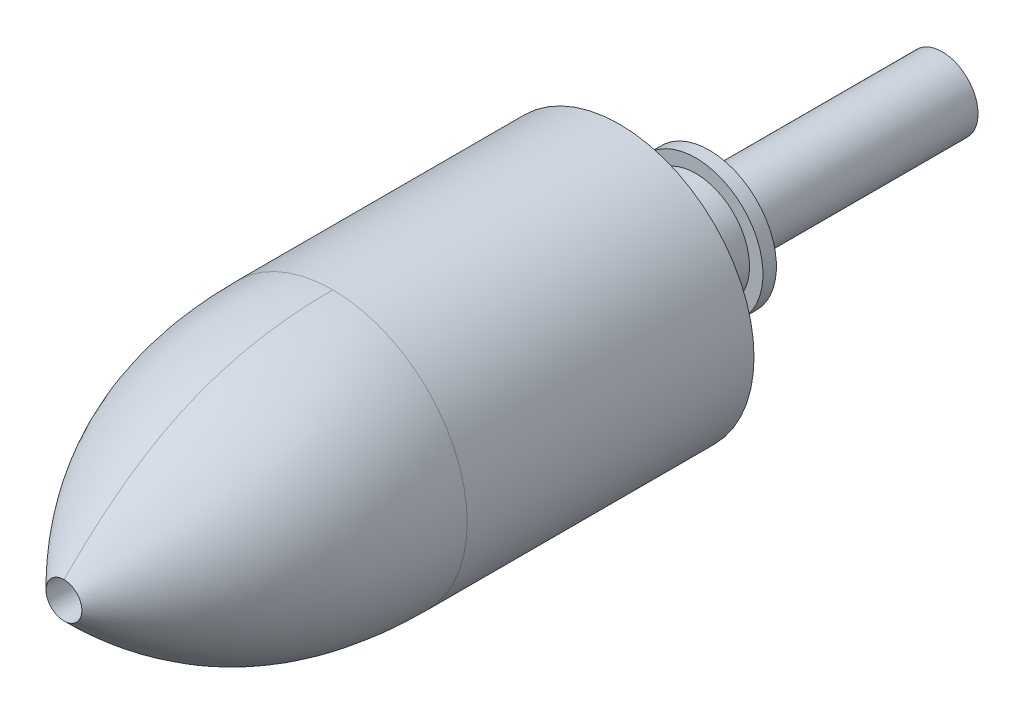
ISO-10303-21;
HEADER;
FILE_DESCRIPTION(('STEP AP214'),'2;1');
FILE_NAME('part.step','',(''),(''),'','','');
FILE_SCHEMA(('AUTOMOTIVE_DESIGN { 1 0 10303 214 1 1 1 1 }'));
ENDSEC;
DATA;
#1=APPLICATION_CONTEXT('core data for automotive mechanical design processes');
#2=APPLICATION_PROTOCOL_DEFINITION('international standard','automotive_design',2000,#1);
#3=PRODUCT_CONTEXT('',#1,'mechanical');
#4=PRODUCT('Part','Part','',(#3));
#5=PRODUCT_RELATED_PRODUCT_CATEGORY('part','',(#4));
#6=PRODUCT_DEFINITION_FORMATION('','',#4);
#7=PRODUCT_DEFINITION_CONTEXT('part definition',#1,'design');
#8=PRODUCT_DEFINITION('design','',#6,#7);
#9=PRODUCT_DEFINITION_SHAPE('','',#8);
#10=(LENGTH_UNIT() NAMED_UNIT(*) SI_UNIT(.MILLI.,.METRE.));
#11=(NAMED_UNIT(*) PLANE_ANGLE_UNIT() SI_UNIT($,.RADIAN.));
#12=(NAMED_UNIT(*) SI_UNIT($,.STERADIAN.) SOLID_ANGLE_UNIT());
#13=UNCERTAINTY_MEASURE_WITH_UNIT(LENGTH_MEASURE(1.E-05),#10,'distance_accuracy_value','');
#14=(GEOMETRIC_REPRESENTATION_CONTEXT(3) GLOBAL_UNCERTAINTY_ASSIGNED_CONTEXT((#13)) GLOBAL_UNIT_ASSIGNED_CONTEXT((#10,
#11,#12)) REPRESENTATION_CONTEXT('',''));
#15=CARTESIAN_POINT('',(0.,0.,0.));
#16=DIRECTION('',(0.,0.,1.));
#17=DIRECTION('',(1.,0.,0.));
#18=AXIS2_PLACEMENT_3D('',#15,#16,#17);
#19=CARTESIAN_POINT('',(0.,0.,-36.));
#20=DIRECTION('',(0.,0.,1.));
#21=DIRECTION('',(1.,0.,0.));
#22=AXIS2_PLACEMENT_3D('',#19,#20,#21);
#23=PLANE('',#22);
#24=CARTESIAN_POINT('',(0.,0.,-36.));
#25=DIRECTION('',(0.,0.,-1.));
#26=DIRECTION('',(-1.,0.,0.));
#27=AXIS2_PLACEMENT_3D('',#24,#25,#26);
#28=CIRCLE('',#27,4.);
#29=CARTESIAN_POINT('',(-4.,0.,-36.));
#30=VERTEX_POINT('',#29);
#31=EDGE_CURVE('E20',#30,#30,#28,.F.);
#32=ORIENTED_EDGE('',*,*,#31,.F.);
#33=EDGE_LOOP('',(#32));
#34=FACE_BOUND('',#33,.T.);
#35=ADVANCED_FACE('F17',(#34),#23,.F.);
#36=CARTESIAN_POINT('',(0.,0.,-28.1658986175115));
#37=DIRECTION('',(0.,0.,-1.));
#38=DIRECTION('',(-1.,0.,0.));
#39=AXIS2_PLACEMENT_3D('',#36,#37,#38);
#40=CYLINDRICAL_SURFACE('',#39,4.);
#41=ORIENTED_EDGE('',*,*,#31,.T.);
#42=EDGE_LOOP('',(#41));
#43=FACE_BOUND('',#42,.T.);
#44=CARTESIAN_POINT('',(0.,0.,-10.));
#45=DIRECTION('',(0.,0.,-1.));
#46=DIRECTION('',(-1.,0.,0.));
#47=AXIS2_PLACEMENT_3D('',#44,#45,#46);
#48=CIRCLE('',#47,4.);
#49=CARTESIAN_POINT('',(-4.,0.,-10.));
#50=VERTEX_POINT('',#49);
#51=EDGE_CURVE('E79',#50,#50,#48,.T.);
#52=ORIENTED_EDGE('',*,*,#51,.T.);
#53=EDGE_LOOP('',(#52));
#54=FACE_BOUND('',#53,.T.);
#55=ADVANCED_FACE('F86',(#43,#54),#40,.T.);
#56=CARTESIAN_POINT('',(0.,0.,-10.));
#57=DIRECTION('',(0.,0.,1.));
#58=DIRECTION('',(1.,0.,0.));
#59=AXIS2_PLACEMENT_3D('',#56,#57,#58);
#60=PLANE('',#59);
#61=ORIENTED_EDGE('',*,*,#51,.F.);
#62=EDGE_LOOP('',(#61));
#63=FACE_BOUND('',#62,.T.);
#64=CARTESIAN_POINT('',(0.,0.,-10.));
#65=DIRECTION('',(0.,0.,-1.));
#66=DIRECTION('',(-1.,0.,0.));
#67=AXIS2_PLACEMENT_3D('',#64,#65,#66);
#68=CIRCLE('',#67,7.5);
#69=CARTESIAN_POINT('',(-7.5,0.,-10.));
#70=VERTEX_POINT('',#69);
#71=EDGE_CURVE('E77',#70,#70,#68,.F.);
#72=ORIENTED_EDGE('',*,*,#71,.F.);
#73=EDGE_LOOP('',(#72));
#74=FACE_BOUND('',#73,.T.);
#75=ADVANCED_FACE('F93',(#63,#74),#60,.F.);
#76=CARTESIAN_POINT('',(0.,0.,-28.1658986175115));
#77=DIRECTION('',(0.,0.,-1.));
#78=DIRECTION('',(-1.,0.,0.));
#79=AXIS2_PLACEMENT_3D('',#76,#77,#78);
#80=CYLINDRICAL_SURFACE('',#79,7.5);
#81=ORIENTED_EDGE('',*,*,#71,.T.);
#82=EDGE_LOOP('',(#81));
#83=FACE_BOUND('',#82,.T.);
#84=CARTESIAN_POINT('',(0.,0.,-8.5));
#85=DIRECTION('',(0.,0.,-1.));
#86=DIRECTION('',(-1.,0.,0.));
#87=AXIS2_PLACEMENT_3D('',#84,#85,#86);
#88=CIRCLE('',#87,7.5);
#89=CARTESIAN_POINT('',(-7.5,0.,-8.5));
#90=VERTEX_POINT('',#89);
#91=EDGE_CURVE('E74',#90,#90,#88,.T.);
#92=ORIENTED_EDGE('',*,*,#91,.T.);
#93=EDGE_LOOP('',(#92));
#94=FACE_BOUND('',#93,.T.);
#95=ADVANCED_FACE('F138',(#83,#94),#80,.T.);
#96=CARTESIAN_POINT('',(0.,0.,41.));
#97=DIRECTION('',(0.,0.,-1.));
#98=DIRECTION('',(-1.,0.,0.));
#99=AXIS2_PLACEMENT_3D('',#96,#97,#98);
#100=PLANE('',#99);
#101=CARTESIAN_POINT('',(0.,0.,41.));
#102=DIRECTION('',(0.,0.,-1.));
#103=DIRECTION('',(-1.,0.,0.));
#104=AXIS2_PLACEMENT_3D('',#101,#102,#103);
#105=CIRCLE('',#104,1.99999999999999);
#106=CARTESIAN_POINT('',(-1.99999999999999,0.,41.));
#107=VERTEX_POINT('',#106);
#108=EDGE_CURVE('E71',#107,#107,#105,.F.);
#109=ORIENTED_EDGE('',*,*,#108,.T.);
#110=EDGE_LOOP('',(#109));
#111=FACE_BOUND('',#110,.T.);
#112=ADVANCED_FACE('F134',(#111),#100,.F.);
#113=CARTESIAN_POINT('',(0.,0.,-8.5));
#114=DIRECTION('',(0.,0.,-1.));
#115=DIRECTION('',(-1.,0.,0.));
#116=AXIS2_PLACEMENT_3D('',#113,#114,#115);
#117=PLANE('',#116);
#118=CARTESIAN_POINT('',(0.,0.,-8.5));
#119=DIRECTION('',(0.,0.,-1.));
#120=DIRECTION('',(-1.,0.,0.));
#121=AXIS2_PLACEMENT_3D('',#118,#119,#120);
#122=CIRCLE('',#121,6.);
#123=CARTESIAN_POINT('',(-6.,0.,-8.5));
#124=VERTEX_POINT('',#123);
#125=EDGE_CURVE('E53',#124,#124,#122,.F.);
#126=ORIENTED_EDGE('',*,*,#125,.F.);
#127=EDGE_LOOP('',(#126));
#128=FACE_BOUND('',#127,.T.);
#129=ORIENTED_EDGE('',*,*,#91,.F.);
#130=EDGE_LOOP('',(#129));
#131=FACE_BOUND('',#130,.T.);
#132=ADVANCED_FACE('F130',(#128,#131),#117,.F.);
#133=CARTESIAN_POINT('',(0.,0.,-28.1658986175115));
#134=DIRECTION('',(0.,0.,-1.));
#135=DIRECTION('',(-1.,0.,0.));
#136=AXIS2_PLACEMENT_3D('',#133,#134,#135);
#137=CYLINDRICAL_SURFACE('',#136,1.99999999999999);
#138=ORIENTED_EDGE('',*,*,#108,.F.);
#139=EDGE_LOOP('',(#138));
#140=FACE_BOUND('',#139,.T.);
#141=CARTESIAN_POINT('',(0.,0.,62.));
#142=DIRECTION('',(0.,0.,1.));
#143=DIRECTION('',(1.,0.,0.));
#144=AXIS2_PLACEMENT_3D('',#141,#142,#143);
#145=CIRCLE('',#144,1.99999999999999);
#146=CARTESIAN_POINT('',(0.,1.99999999999999,62.));
#147=VERTEX_POINT('',#146);
#148=CARTESIAN_POINT('',(0.,-1.99999999999999,62.));
#149=VERTEX_POINT('',#148);
#150=EDGE_CURVE('E44',#147,#149,#145,.T.);
#151=ORIENTED_EDGE('',*,*,#150,.T.);
#152=CARTESIAN_POINT('',(0.,0.,62.));
#153=DIRECTION('',(0.,0.,1.));
#154=DIRECTION('',(1.,0.,0.));
#155=AXIS2_PLACEMENT_3D('',#152,#153,#154);
#156=CIRCLE('',#155,1.99999999999999);
#157=EDGE_CURVE('E51',#149,#147,#156,.T.);
#158=ORIENTED_EDGE('',*,*,#157,.T.);
#159=EDGE_LOOP('',(#151,#158));
#160=FACE_BOUND('',#159,.T.);
#161=ADVANCED_FACE('F52',(#140,#160),#137,.F.);
#162=CARTESIAN_POINT('',(0.,0.,-28.1658986175115));
#163=DIRECTION('',(0.,0.,-1.));
#164=DIRECTION('',(-1.,0.,0.));
#165=AXIS2_PLACEMENT_3D('',#162,#163,#164);
#166=CYLINDRICAL_SURFACE('',#165,6.);
#167=ORIENTED_EDGE('',*,*,#125,.T.);
#168=EDGE_LOOP('',(#167));
#169=FACE_BOUND('',#168,.T.);
#170=CARTESIAN_POINT('',(0.,0.,0.));
#171=DIRECTION('',(0.,0.,-1.));
#172=DIRECTION('',(-1.,0.,0.));
#173=AXIS2_PLACEMENT_3D('',#170,#171,#172);
#174=CIRCLE('',#173,6.);
#175=CARTESIAN_POINT('',(-6.,0.,0.));
#176=VERTEX_POINT('',#175);
#177=EDGE_CURVE('E66',#176,#176,#174,.F.);
#178=ORIENTED_EDGE('',*,*,#177,.F.);
#179=EDGE_LOOP('',(#178));
#180=FACE_BOUND('',#179,.T.);
#181=ADVANCED_FACE('F119',(#169,#180),#166,.T.);
#182=CARTESIAN_POINT('',(0.,1.99999999999999,62.));
#183=CARTESIAN_POINT('',(3.99999999999998,1.99999999999999,62.));
#184=CARTESIAN_POINT('',(3.99999999999998,-1.99999999999999,62.));
#185=CARTESIAN_POINT('',(0.,-1.99999999999999,62.));
#186=CARTESIAN_POINT('',(0.,10.6022661572464,53.4742452033489));
#187=CARTESIAN_POINT('',(21.2045323144928,10.6022661572464,53.4742452033489));
#188=CARTESIAN_POINT('',(21.2045323144928,-10.6022661572464,53.4742452033489));
#189=CARTESIAN_POINT('',(0.,-10.6022661572464,53.4742452033489));
#190=CARTESIAN_POINT('',(0.,15.,45.095019725517));
#191=CARTESIAN_POINT('',(30.,15.,45.095019725517));
#192=CARTESIAN_POINT('',(30.,-15.,45.095019725517));
#193=CARTESIAN_POINT('',(0.,-15.,45.095019725517));
#194=CARTESIAN_POINT('',(0.,15.,32.));
#195=CARTESIAN_POINT('',(30.,15.,32.));
#196=CARTESIAN_POINT('',(30.,-15.,32.));
#197=CARTESIAN_POINT('',(0.,-15.,32.));
#198=(BOUNDED_SURFACE() B_SPLINE_SURFACE(3,3,((#182,#183,#184,#185),(#186,#187,#188,#189),(#190,
#191,#192,#193),(#194,#195,#196,#197)),.UNSPECIFIED.,.F.,.F.,
.F.) B_SPLINE_SURFACE_WITH_KNOTS((4,4),(4,4),(0.,1.),(0.,1.),
.UNSPECIFIED.) GEOMETRIC_REPRESENTATION_ITEM() RATIONAL_B_SPLINE_SURFACE(((1.,0.333333333333333,
0.333333333333333,1.),(1.,0.333333333333333,0.333333333333333,1.),(1.,0.333333333333333,
0.333333333333333,1.),(1.,0.333333333333333,0.333333333333333,1.))) REPRESENTATION_ITEM('') SURFACE());
#199=CARTESIAN_POINT('',(0.,-1.99999999999999,62.));
#200=CARTESIAN_POINT('',(0.,-10.6022661572464,53.4742452033489));
#201=CARTESIAN_POINT('',(0.,-15.,45.095019725517));
#202=CARTESIAN_POINT('',(0.,-15.,32.));
#203=B_SPLINE_CURVE_WITH_KNOTS('',3,(#199,#200,#201,#202),.UNSPECIFIED.,.F.,.F.,(4,4),(0.,1.),.UNSPECIFIED.);
#204=CARTESIAN_POINT('',(0.,-15.,32.));
#205=VERTEX_POINT('',#204);
#206=EDGE_CURVE('E35',#149,#205,#203,.T.);
#207=CARTESIAN_POINT('',(0.,0.,32.));
#208=DIRECTION('',(0.,0.,-1.));
#209=DIRECTION('',(-1.,0.,0.));
#210=AXIS2_PLACEMENT_3D('',#207,#208,#209);
#211=CIRCLE('',#210,15.);
#212=CARTESIAN_POINT('',(0.,15.,32.));
#213=VERTEX_POINT('',#212);
#214=EDGE_CURVE('E57',#213,#205,#211,.T.);
#215=CARTESIAN_POINT('',(0.,1.99999999999999,62.));
#216=CARTESIAN_POINT('',(0.,10.6022661572464,53.4742452033489));
#217=CARTESIAN_POINT('',(0.,15.,45.095019725517));
#218=CARTESIAN_POINT('',(0.,15.,32.));
#219=B_SPLINE_CURVE_WITH_KNOTS('',3,(#215,#216,#217,#218),.UNSPECIFIED.,.F.,.F.,(4,4),(0.,1.),.UNSPECIFIED.);
#220=EDGE_CURVE('E49',#213,#147,#219,.F.);
#221=ORIENTED_EDGE('',*,*,#206,.T.);
#222=ORIENTED_EDGE('',*,*,#214,.F.);
#223=ORIENTED_EDGE('',*,*,#220,.T.);
#224=ORIENTED_EDGE('',*,*,#157,.F.);
#225=EDGE_LOOP('',(#221,#222,#223,#224));
#226=FACE_BOUND('',#225,.T.);
#227=ADVANCED_FACE('F55',(#226),#198,.F.);
#228=CARTESIAN_POINT('',(0.,-1.99999999999999,62.));
#229=CARTESIAN_POINT('',(-3.99999999999998,-1.99999999999999,62.));
#230=CARTESIAN_POINT('',(-3.99999999999998,1.99999999999999,62.));
#231=CARTESIAN_POINT('',(0.,1.99999999999999,62.));
#232=CARTESIAN_POINT('',(0.,-10.6022661572464,53.4742452033489));
#233=CARTESIAN_POINT('',(-21.2045323144928,-10.6022661572464,53.4742452033489));
#234=CARTESIAN_POINT('',(-21.2045323144928,10.6022661572464,53.4742452033489));
#235=CARTESIAN_POINT('',(0.,10.6022661572464,53.4742452033489));
#236=CARTESIAN_POINT('',(0.,-15.,45.095019725517));
#237=CARTESIAN_POINT('',(-30.,-15.,45.095019725517));
#238=CARTESIAN_POINT('',(-30.,15.,45.095019725517));
#239=CARTESIAN_POINT('',(0.,15.,45.095019725517));
#240=CARTESIAN_POINT('',(0.,-15.,32.));
#241=CARTESIAN_POINT('',(-30.,-15.,32.));
#242=CARTESIAN_POINT('',(-30.,15.,32.));
#243=CARTESIAN_POINT('',(0.,15.,32.));
#244=(BOUNDED_SURFACE() B_SPLINE_SURFACE(3,3,((#228,#229,#230,#231),(#232,#233,#234,#235),(#236,
#237,#238,#239),(#240,#241,#242,#243)),.UNSPECIFIED.,.F.,.F.,
.F.) B_SPLINE_SURFACE_WITH_KNOTS((4,4),(4,4),(0.,1.),(0.,1.),
.UNSPECIFIED.) GEOMETRIC_REPRESENTATION_ITEM() RATIONAL_B_SPLINE_SURFACE(((1.,0.333333333333333,
0.333333333333333,1.),(1.,0.333333333333333,0.333333333333333,1.),(1.,0.333333333333333,
0.333333333333333,1.),(1.,0.333333333333333,0.333333333333333,1.))) REPRESENTATION_ITEM('') SURFACE());
#245=CARTESIAN_POINT('',(0.,0.,32.));
#246=DIRECTION('',(0.,0.,-1.));
#247=DIRECTION('',(-1.,0.,0.));
#248=AXIS2_PLACEMENT_3D('',#245,#246,#247);
#249=CIRCLE('',#248,15.);
#250=EDGE_CURVE('E26',#205,#213,#249,.T.);
#251=ORIENTED_EDGE('',*,*,#150,.F.);
#252=ORIENTED_EDGE('',*,*,#220,.F.);
#253=ORIENTED_EDGE('',*,*,#250,.F.);
#254=ORIENTED_EDGE('',*,*,#206,.F.);
#255=EDGE_LOOP('',(#251,#252,#253,#254));
#256=FACE_BOUND('',#255,.T.);
#257=ADVANCED_FACE('F47',(#256),#244,.F.);
#258=CARTESIAN_POINT('',(0.,0.,0.));
#259=DIRECTION('',(0.,0.,-1.));
#260=DIRECTION('',(-1.,0.,0.));
#261=AXIS2_PLACEMENT_3D('',#258,#259,#260);
#262=PLANE('',#261);
#263=ORIENTED_EDGE('',*,*,#177,.T.);
#264=EDGE_LOOP('',(#263));
#265=FACE_BOUND('',#264,.T.);
#266=CARTESIAN_POINT('',(0.,0.,0.));
#267=DIRECTION('',(0.,0.,-1.));
#268=DIRECTION('',(-1.,0.,0.));
#269=AXIS2_PLACEMENT_3D('',#266,#267,#268);
#270=CIRCLE('',#269,15.);
#271=CARTESIAN_POINT('',(-15.,0.,0.));
#272=VERTEX_POINT('',#271);
#273=EDGE_CURVE('E11',#272,#272,#270,.F.);
#274=ORIENTED_EDGE('',*,*,#273,.F.);
#275=EDGE_LOOP('',(#274));
#276=FACE_BOUND('',#275,.T.);
#277=ADVANCED_FACE('F96',(#265,#276),#262,.T.);
#278=CARTESIAN_POINT('',(0.,0.,-28.1658986175115));
#279=DIRECTION('',(0.,0.,-1.));
#280=DIRECTION('',(-1.,0.,0.));
#281=AXIS2_PLACEMENT_3D('',#278,#279,#280);
#282=CYLINDRICAL_SURFACE('',#281,15.);
#283=ORIENTED_EDGE('',*,*,#273,.T.);
#284=EDGE_LOOP('',(#283));
#285=FACE_BOUND('',#284,.T.);
#286=ORIENTED_EDGE('',*,*,#250,.T.);
#287=ORIENTED_EDGE('',*,*,#214,.T.);
#288=EDGE_LOOP('',(#286,#287));
#289=FACE_BOUND('',#288,.T.);
#290=ADVANCED_FACE('F94',(#285,#289),#282,.T.);
#291=CLOSED_SHELL('',(#35,#55,#75,#95,#112,#132,#161,#181,#227,#257,#277,#290));
#292=MANIFOLD_SOLID_BREP('B1',#291);
#293=ADVANCED_BREP_SHAPE_REPRESENTATION('',(#18,#292),#14);
#294=SHAPE_DEFINITION_REPRESENTATION(#9,#293);
ENDSEC;
END-ISO-10303-21;
